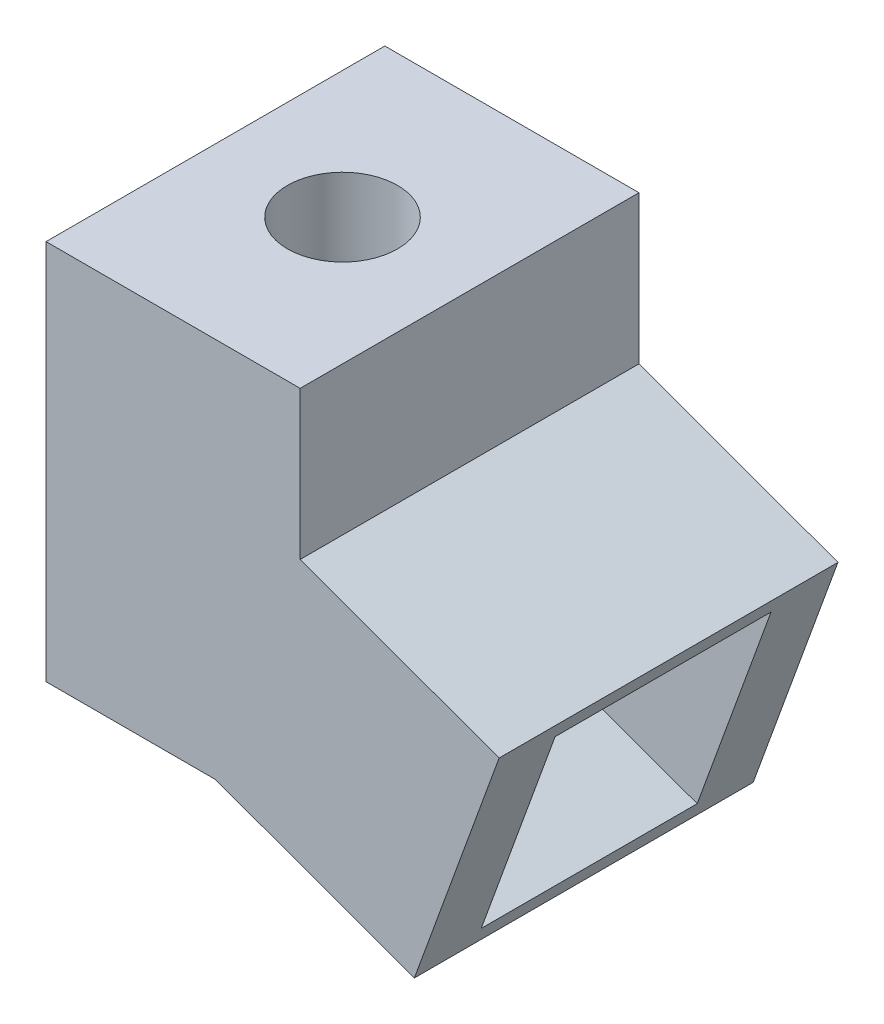
ISO-10303-21;
HEADER;
FILE_DESCRIPTION(('STEP AP214'),'2;1');
FILE_NAME('part.step','',(''),(''),'','','');
FILE_SCHEMA(('AUTOMOTIVE_DESIGN { 1 0 10303 214 1 1 1 1 }'));
ENDSEC;
DATA;
#1=APPLICATION_CONTEXT('core data for automotive mechanical design processes');
#2=APPLICATION_PROTOCOL_DEFINITION('international standard','automotive_design',2000,#1);
#3=PRODUCT_CONTEXT('',#1,'mechanical');
#4=PRODUCT('Part','Part','',(#3));
#5=PRODUCT_RELATED_PRODUCT_CATEGORY('part','',(#4));
#6=PRODUCT_DEFINITION_FORMATION('','',#4);
#7=PRODUCT_DEFINITION_CONTEXT('part definition',#1,'design');
#8=PRODUCT_DEFINITION('design','',#6,#7);
#9=PRODUCT_DEFINITION_SHAPE('','',#8);
#10=(LENGTH_UNIT() NAMED_UNIT(*) SI_UNIT(.MILLI.,.METRE.));
#11=(NAMED_UNIT(*) PLANE_ANGLE_UNIT() SI_UNIT($,.RADIAN.));
#12=(NAMED_UNIT(*) SI_UNIT($,.STERADIAN.) SOLID_ANGLE_UNIT());
#13=UNCERTAINTY_MEASURE_WITH_UNIT(LENGTH_MEASURE(1.E-05),#10,'distance_accuracy_value','');
#14=(GEOMETRIC_REPRESENTATION_CONTEXT(3) GLOBAL_UNCERTAINTY_ASSIGNED_CONTEXT((#13)) GLOBAL_UNIT_ASSIGNED_CONTEXT((#10,
#11,#12)) REPRESENTATION_CONTEXT('',''));
#15=CARTESIAN_POINT('',(0.,0.,0.));
#16=DIRECTION('',(0.,0.,1.));
#17=DIRECTION('',(1.,0.,0.));
#18=AXIS2_PLACEMENT_3D('',#15,#16,#17);
#19=CARTESIAN_POINT('',(10.5,-6.,-6.5));
#20=DIRECTION('',(0.,0.,1.));
#21=DIRECTION('',(1.,0.,0.));
#22=AXIS2_PLACEMENT_3D('',#19,#20,#21);
#23=PLANE('',#22);
#24=DIRECTION('',(0.,1.,0.));
#25=VECTOR('',#24,1.);
#26=CARTESIAN_POINT('',(10.5,-6.,-6.5));
#27=LINE('',#26,#25);
#28=CARTESIAN_POINT('',(10.5,-0.5,-6.5));
#29=VERTEX_POINT('',#28);
#30=CARTESIAN_POINT('',(10.5,3.,-6.5));
#31=VERTEX_POINT('',#30);
#32=EDGE_CURVE('E85',#29,#31,#27,.T.);
#33=ORIENTED_EDGE('',*,*,#32,.F.);
#34=DIRECTION('',(-0.93969262078591,0.342020143325663,0.));
#35=VECTOR('',#34,1.);
#36=CARTESIAN_POINT('',(15.1984631039296,-2.21010071662832,-6.5));
#37=LINE('',#36,#35);
#38=CARTESIAN_POINT('',(15.1984631039296,-2.21010071662832,-6.5));
#39=VERTEX_POINT('',#38);
#40=EDGE_CURVE('E244',#39,#29,#37,.T.);
#41=ORIENTED_EDGE('',*,*,#40,.F.);
#42=DIRECTION('',(0.342020143325663,0.939692620785911,0.));
#43=VECTOR('',#42,1.);
#44=CARTESIAN_POINT('',(15.1984631039296,-2.21010071662832,-6.5));
#45=LINE('',#44,#43);
#46=CARTESIAN_POINT('',(13.1966268154655,-7.71010071662832,-6.5));
#47=VERTEX_POINT('',#46);
#48=EDGE_CURVE('E234',#47,#39,#45,.T.);
#49=ORIENTED_EDGE('',*,*,#48,.F.);
#50=DIRECTION('',(-0.93969262078591,0.342020143325663,0.));
#51=VECTOR('',#50,1.);
#52=CARTESIAN_POINT('',(13.1966268154655,-7.71010071662832,-6.5));
#53=LINE('',#52,#51);
#54=CARTESIAN_POINT('',(8.49816371153593,-6.,-6.5));
#55=VERTEX_POINT('',#54);
#56=EDGE_CURVE('E247',#47,#55,#53,.T.);
#57=ORIENTED_EDGE('',*,*,#56,.T.);
#58=DIRECTION('',(1.,0.,0.));
#59=VECTOR('',#58,1.);
#60=CARTESIAN_POINT('',(10.5,-6.,-6.5));
#61=LINE('',#60,#59);
#62=CARTESIAN_POINT('',(4.5,-6.,-6.5));
#63=VERTEX_POINT('',#62);
#64=EDGE_CURVE('E284',#63,#55,#61,.T.);
#65=ORIENTED_EDGE('',*,*,#64,.F.);
#66=DIRECTION('',(0.,1.,0.));
#67=VECTOR('',#66,1.);
#68=CARTESIAN_POINT('',(4.5,-6.,-6.5));
#69=LINE('',#68,#67);
#70=CARTESIAN_POINT('',(4.5,3.,-6.5));
#71=VERTEX_POINT('',#70);
#72=EDGE_CURVE('E295',#63,#71,#69,.T.);
#73=ORIENTED_EDGE('',*,*,#72,.T.);
#74=DIRECTION('',(-1.,0.,0.));
#75=VECTOR('',#74,1.);
#76=CARTESIAN_POINT('',(4.5,3.,-6.5));
#77=LINE('',#76,#75);
#78=EDGE_CURVE('E207',#31,#71,#77,.T.);
#79=ORIENTED_EDGE('',*,*,#78,.F.);
#80=EDGE_LOOP('',(#33,#41,#49,#57,#65,#73,#79));
#81=FACE_BOUND('',#80,.T.);
#82=ADVANCED_FACE('F77',(#81),#23,.F.);
#83=CARTESIAN_POINT('',(10.5,-6.,1.5));
#84=DIRECTION('',(-1.,0.,0.));
#85=DIRECTION('',(0.,0.,1.));
#86=AXIS2_PLACEMENT_3D('',#83,#84,#85);
#87=PLANE('',#86);
#88=DIRECTION('',(0.,1.,0.));
#89=VECTOR('',#88,1.);
#90=CARTESIAN_POINT('',(10.5,-6.,1.5));
#91=LINE('',#90,#89);
#92=CARTESIAN_POINT('',(10.5,-0.500000000000003,1.5));
#93=VERTEX_POINT('',#92);
#94=CARTESIAN_POINT('',(10.5,3.,1.5));
#95=VERTEX_POINT('',#94);
#96=EDGE_CURVE('E301',#93,#95,#91,.T.);
#97=ORIENTED_EDGE('',*,*,#96,.F.);
#98=DIRECTION('',(0.,0.,-1.));
#99=VECTOR('',#98,1.);
#100=CARTESIAN_POINT('',(10.5,-0.5,7.3529777486175));
#101=LINE('',#100,#99);
#102=EDGE_CURVE('E272',#93,#29,#101,.T.);
#103=ORIENTED_EDGE('',*,*,#102,.T.);
#104=ORIENTED_EDGE('',*,*,#32,.T.);
#105=DIRECTION('',(0.,0.,-1.));
#106=VECTOR('',#105,1.);
#107=CARTESIAN_POINT('',(10.5,3.,-6.5));
#108=LINE('',#107,#106);
#109=EDGE_CURVE('E203',#95,#31,#108,.T.);
#110=ORIENTED_EDGE('',*,*,#109,.F.);
#111=EDGE_LOOP('',(#97,#103,#104,#110));
#112=FACE_BOUND('',#111,.T.);
#113=ADVANCED_FACE('F308',(#112),#87,.F.);
#114=CARTESIAN_POINT('',(10.5,-6.,1.5));
#115=DIRECTION('',(0.,0.,-1.));
#116=DIRECTION('',(-1.,0.,0.));
#117=AXIS2_PLACEMENT_3D('',#114,#115,#116);
#118=PLANE('',#117);
#119=DIRECTION('',(-1.,0.,0.));
#120=VECTOR('',#119,1.);
#121=CARTESIAN_POINT('',(10.5,-6.,1.5));
#122=LINE('',#121,#120);
#123=CARTESIAN_POINT('',(8.49816371153593,-6.,1.5));
#124=VERTEX_POINT('',#123);
#125=CARTESIAN_POINT('',(4.5,-6.,1.5));
#126=VERTEX_POINT('',#125);
#127=EDGE_CURVE('E290',#124,#126,#122,.T.);
#128=ORIENTED_EDGE('',*,*,#127,.F.);
#129=DIRECTION('',(-0.93969262078591,0.342020143325663,0.));
#130=VECTOR('',#129,1.);
#131=CARTESIAN_POINT('',(13.1966268154655,-7.71010071662832,1.5));
#132=LINE('',#131,#130);
#133=CARTESIAN_POINT('',(13.1966268154655,-7.71010071662832,1.5));
#134=VERTEX_POINT('',#133);
#135=EDGE_CURVE('E251',#134,#124,#132,.T.);
#136=ORIENTED_EDGE('',*,*,#135,.F.);
#137=DIRECTION('',(-0.342020143325663,-0.93969262078591,0.));
#138=VECTOR('',#137,1.);
#139=CARTESIAN_POINT('',(15.1984631039296,-2.21010071662832,1.5));
#140=LINE('',#139,#138);
#141=CARTESIAN_POINT('',(15.1984631039296,-2.21010071662832,1.5));
#142=VERTEX_POINT('',#141);
#143=EDGE_CURVE('E227',#142,#134,#140,.T.);
#144=ORIENTED_EDGE('',*,*,#143,.F.);
#145=DIRECTION('',(-0.93969262078591,0.342020143325663,0.));
#146=VECTOR('',#145,1.);
#147=CARTESIAN_POINT('',(15.1984631039296,-2.21010071662832,1.5));
#148=LINE('',#147,#146);
#149=EDGE_CURVE('E240',#142,#93,#148,.T.);
#150=ORIENTED_EDGE('',*,*,#149,.T.);
#151=ORIENTED_EDGE('',*,*,#96,.T.);
#152=DIRECTION('',(1.,0.,0.));
#153=VECTOR('',#152,1.);
#154=CARTESIAN_POINT('',(4.5,3.,1.5));
#155=LINE('',#154,#153);
#156=CARTESIAN_POINT('',(4.5,3.,1.5));
#157=VERTEX_POINT('',#156);
#158=EDGE_CURVE('E195',#157,#95,#155,.T.);
#159=ORIENTED_EDGE('',*,*,#158,.F.);
#160=DIRECTION('',(0.,1.,0.));
#161=VECTOR('',#160,1.);
#162=CARTESIAN_POINT('',(4.5,-6.,1.5));
#163=LINE('',#162,#161);
#164=EDGE_CURVE('E298',#126,#157,#163,.T.);
#165=ORIENTED_EDGE('',*,*,#164,.F.);
#166=EDGE_LOOP('',(#128,#136,#144,#150,#151,#159,#165));
#167=FACE_BOUND('',#166,.T.);
#168=ADVANCED_FACE('F322',(#167),#118,.F.);
#169=CARTESIAN_POINT('',(4.5,-6.,1.5));
#170=DIRECTION('',(1.,0.,0.));
#171=DIRECTION('',(0.,0.,-1.));
#172=AXIS2_PLACEMENT_3D('',#169,#170,#171);
#173=PLANE('',#172);
#174=DIRECTION('',(0.,0.,1.));
#175=VECTOR('',#174,1.);
#176=CARTESIAN_POINT('',(4.5,3.,-6.5));
#177=LINE('',#176,#175);
#178=EDGE_CURVE('E192',#71,#157,#177,.T.);
#179=ORIENTED_EDGE('',*,*,#178,.F.);
#180=ORIENTED_EDGE('',*,*,#72,.F.);
#181=DIRECTION('',(0.,0.,-1.));
#182=VECTOR('',#181,1.);
#183=CARTESIAN_POINT('',(4.5,-6.,1.5));
#184=LINE('',#183,#182);
#185=EDGE_CURVE('E100',#126,#63,#184,.T.);
#186=ORIENTED_EDGE('',*,*,#185,.F.);
#187=ORIENTED_EDGE('',*,*,#164,.T.);
#188=EDGE_LOOP('',(#179,#180,#186,#187));
#189=FACE_BOUND('',#188,.T.);
#190=ADVANCED_FACE('F318',(#189),#173,.F.);
#191=CARTESIAN_POINT('',(0.,-6.,0.));
#192=DIRECTION('',(0.,-1.,0.));
#193=DIRECTION('',(0.,0.,-1.));
#194=AXIS2_PLACEMENT_3D('',#191,#192,#193);
#195=PLANE('',#194);
#196=DIRECTION('',(0.,0.,-1.));
#197=VECTOR('',#196,1.);
#198=CARTESIAN_POINT('',(8.49816371153592,-6.,7.3529777486175));
#199=LINE('',#198,#197);
#200=EDGE_CURVE('E281',#124,#55,#199,.T.);
#201=ORIENTED_EDGE('',*,*,#200,.F.);
#202=ORIENTED_EDGE('',*,*,#127,.T.);
#203=ORIENTED_EDGE('',*,*,#185,.T.);
#204=ORIENTED_EDGE('',*,*,#64,.T.);
#205=EDGE_LOOP('',(#201,#202,#203,#204));
#206=FACE_BOUND('',#205,.T.);
#207=ADVANCED_FACE('F337',(#206),#195,.T.);
#208=CARTESIAN_POINT('',(14.1308933327259,-5.14322455670285,0.));
#209=DIRECTION('',(0.93969262078591,-0.342020143325663,0.));
#210=DIRECTION('',(0.342020143325663,0.93969262078591,0.));
#211=AXIS2_PLACEMENT_3D('',#208,#209,#210);
#212=PLANE('',#211);
#213=ORIENTED_EDGE('',*,*,#143,.T.);
#214=DIRECTION('',(0.,0.,-1.));
#215=VECTOR('',#214,1.);
#216=CARTESIAN_POINT('',(13.1966268154655,-7.71010071662832,1.5));
#217=LINE('',#216,#215);
#218=EDGE_CURVE('E231',#134,#47,#217,.T.);
#219=ORIENTED_EDGE('',*,*,#218,.T.);
#220=ORIENTED_EDGE('',*,*,#48,.T.);
#221=DIRECTION('',(0.,0.,1.));
#222=VECTOR('',#221,1.);
#223=CARTESIAN_POINT('',(15.1984631039296,-2.21010071662832,1.5));
#224=LINE('',#223,#222);
#225=EDGE_CURVE('E237',#39,#142,#224,.T.);
#226=ORIENTED_EDGE('',*,*,#225,.T.);
#227=EDGE_LOOP('',(#213,#219,#220,#226));
#228=FACE_BOUND('',#227,.T.);
#229=DIRECTION('',(0.,0.,-1.));
#230=VECTOR('',#229,1.);
#231=CARTESIAN_POINT('',(13.3253935942171,-7.35631689963239,0.0500000000000049));
#232=LINE('',#231,#230);
#233=CARTESIAN_POINT('',(13.3253935942171,-7.35631689963239,0.0500000000000049));
#234=VERTEX_POINT('',#233);
#235=CARTESIAN_POINT('',(13.3253935942171,-7.35631689963239,-5.05));
#236=VERTEX_POINT('',#235);
#237=EDGE_CURVE('E215',#234,#236,#232,.T.);
#238=ORIENTED_EDGE('',*,*,#237,.F.);
#239=DIRECTION('',(-0.342020143325663,-0.93969262078591,0.));
#240=VECTOR('',#239,1.);
#241=CARTESIAN_POINT('',(15.069696325178,-2.56388453362425,0.0500000000000053));
#242=LINE('',#241,#240);
#243=CARTESIAN_POINT('',(15.069696325178,-2.56388453362425,0.0500000000000053));
#244=VERTEX_POINT('',#243);
#245=EDGE_CURVE('E211',#244,#234,#242,.T.);
#246=ORIENTED_EDGE('',*,*,#245,.F.);
#247=DIRECTION('',(0.,0.,1.));
#248=VECTOR('',#247,1.);
#249=CARTESIAN_POINT('',(15.069696325178,-2.56388453362425,0.0500000000000053));
#250=LINE('',#249,#248);
#251=CARTESIAN_POINT('',(15.069696325178,-2.56388453362425,-5.04999999999999));
#252=VERTEX_POINT('',#251);
#253=EDGE_CURVE('E223',#252,#244,#250,.T.);
#254=ORIENTED_EDGE('',*,*,#253,.F.);
#255=DIRECTION('',(0.342020143325663,0.939692620785911,0.));
#256=VECTOR('',#255,1.);
#257=CARTESIAN_POINT('',(15.069696325178,-2.56388453362425,-5.04999999999999));
#258=LINE('',#257,#256);
#259=EDGE_CURVE('E219',#236,#252,#258,.T.);
#260=ORIENTED_EDGE('',*,*,#259,.F.);
#261=EDGE_LOOP('',(#238,#246,#254,#260));
#262=FACE_BOUND('',#261,.T.);
#263=ADVANCED_FACE('F332',(#228,#262),#212,.T.);
#264=CARTESIAN_POINT('',(13.1966268154655,-7.71010071662832,1.5));
#265=DIRECTION('',(0.342020143325663,0.93969262078591,0.));
#266=DIRECTION('',(-0.93969262078591,0.342020143325663,0.));
#267=AXIS2_PLACEMENT_3D('',#264,#265,#266);
#268=PLANE('',#267);
#269=ORIENTED_EDGE('',*,*,#200,.T.);
#270=ORIENTED_EDGE('',*,*,#56,.F.);
#271=ORIENTED_EDGE('',*,*,#218,.F.);
#272=ORIENTED_EDGE('',*,*,#135,.T.);
#273=EDGE_LOOP('',(#269,#270,#271,#272));
#274=FACE_BOUND('',#273,.T.);
#275=ADVANCED_FACE('F335',(#274),#268,.F.);
#276=CARTESIAN_POINT('',(15.1984631039296,-2.21010071662832,1.5));
#277=DIRECTION('',(-0.342020143325663,-0.93969262078591,0.));
#278=DIRECTION('',(0.93969262078591,-0.342020143325663,0.));
#279=AXIS2_PLACEMENT_3D('',#276,#277,#278);
#280=PLANE('',#279);
#281=ORIENTED_EDGE('',*,*,#102,.F.);
#282=ORIENTED_EDGE('',*,*,#149,.F.);
#283=ORIENTED_EDGE('',*,*,#225,.F.);
#284=ORIENTED_EDGE('',*,*,#40,.T.);
#285=EDGE_LOOP('',(#281,#282,#283,#284));
#286=FACE_BOUND('',#285,.T.);
#287=ADVANCED_FACE('F328',(#286),#280,.F.);
#288=CARTESIAN_POINT('',(7.55304498722449,-2.74908355342321,0.));
#289=DIRECTION('',(-0.93969262078591,0.342020143325663,0.));
#290=DIRECTION('',(-0.342020143325663,-0.93969262078591,0.));
#291=AXIS2_PLACEMENT_3D('',#288,#289,#290);
#292=PLANE('',#291);
#293=DIRECTION('',(0.,0.,1.));
#294=VECTOR('',#293,1.);
#295=CARTESIAN_POINT('',(8.49184797967659,-0.1697435303446,-5.04999999999999));
#296=LINE('',#295,#294);
#297=CARTESIAN_POINT('',(8.49184797967659,-0.1697435303446,-5.04999999999999));
#298=VERTEX_POINT('',#297);
#299=CARTESIAN_POINT('',(8.49184797967659,-0.169743530344602,-3.34037942931242));
#300=VERTEX_POINT('',#299);
#301=EDGE_CURVE('E190',#298,#300,#296,.T.);
#302=ORIENTED_EDGE('',*,*,#301,.T.);
#303=CARTESIAN_POINT('',(7.5,-2.89482345803777,-2.5));
#304=DIRECTION('',(-0.93969262078591,0.342020143325663,0.));
#305=DIRECTION('',(0.342020143325663,0.93969262078591,0.));
#306=AXIS2_PLACEMENT_3D('',#303,#304,#305);
#307=ELLIPSE('',#306,3.80094572021207,1.3);
#308=CARTESIAN_POINT('',(7.82568910364889,-2.,-3.75854146048685));
#309=VERTEX_POINT('',#308);
#310=EDGE_CURVE('E92',#300,#309,#307,.T.);
#311=ORIENTED_EDGE('',*,*,#310,.T.);
#312=DIRECTION('',(0.,0.,-1.));
#313=VECTOR('',#312,1.);
#314=CARTESIAN_POINT('',(7.82568910364889,-2.,0.));
#315=LINE('',#314,#313);
#316=CARTESIAN_POINT('',(7.82568910364889,-2.,-1.24145853951315));
#317=VERTEX_POINT('',#316);
#318=EDGE_CURVE('E12',#317,#309,#315,.T.);
#319=ORIENTED_EDGE('',*,*,#318,.F.);
#320=CARTESIAN_POINT('',(8.49184797967659,-0.169743530344603,-1.65962057068758));
#321=VERTEX_POINT('',#320);
#322=EDGE_CURVE('E171',#317,#321,#307,.T.);
#323=ORIENTED_EDGE('',*,*,#322,.T.);
#324=CARTESIAN_POINT('',(8.49184797967659,-0.169743530344604,0.0500000000000043));
#325=VERTEX_POINT('',#324);
#326=EDGE_CURVE('E265',#321,#325,#296,.T.);
#327=ORIENTED_EDGE('',*,*,#326,.T.);
#328=DIRECTION('',(-0.342020143325663,-0.93969262078591,0.));
#329=VECTOR('',#328,1.);
#330=CARTESIAN_POINT('',(8.49184797967659,-0.169743530344604,0.0500000000000043));
#331=LINE('',#330,#329);
#332=CARTESIAN_POINT('',(6.7475452487157,-4.96217589635275,0.05));
#333=VERTEX_POINT('',#332);
#334=EDGE_CURVE('E254',#325,#333,#331,.T.);
#335=ORIENTED_EDGE('',*,*,#334,.T.);
#336=DIRECTION('',(0.,0.,-1.));
#337=VECTOR('',#336,1.);
#338=CARTESIAN_POINT('',(6.74754524871571,-4.96217589635274,-5.05));
#339=LINE('',#338,#337);
#340=CARTESIAN_POINT('',(6.74754524871571,-4.96217589635274,-5.05));
#341=VERTEX_POINT('',#340);
#342=EDGE_CURVE('E258',#333,#341,#339,.T.);
#343=ORIENTED_EDGE('',*,*,#342,.T.);
#344=DIRECTION('',(0.342020143325663,0.93969262078591,0.));
#345=VECTOR('',#344,1.);
#346=CARTESIAN_POINT('',(8.49184797967659,-0.1697435303446,-5.04999999999999));
#347=LINE('',#346,#345);
#348=EDGE_CURVE('E262',#341,#298,#347,.T.);
#349=ORIENTED_EDGE('',*,*,#348,.T.);
#350=EDGE_LOOP('',(#302,#311,#319,#323,#327,#335,#343,#349));
#351=FACE_BOUND('',#350,.T.);
#352=ADVANCED_FACE('F187',(#351),#292,.F.);
#353=CARTESIAN_POINT('',(8.49184797967659,-0.1697435303446,-5.04999999999999));
#354=DIRECTION('',(0.,0.,-1.));
#355=DIRECTION('',(0.,1.,0.));
#356=AXIS2_PLACEMENT_3D('',#353,#354,#355);
#357=PLANE('',#356);
#358=DIRECTION('',(0.93969262078591,-0.342020143325663,0.));
#359=VECTOR('',#358,1.);
#360=CARTESIAN_POINT('',(6.74754524871571,-4.96217589635274,-5.05));
#361=LINE('',#360,#359);
#362=EDGE_CURVE('E276',#341,#236,#361,.T.);
#363=ORIENTED_EDGE('',*,*,#362,.T.);
#364=ORIENTED_EDGE('',*,*,#259,.T.);
#365=DIRECTION('',(0.93969262078591,-0.342020143325663,0.));
#366=VECTOR('',#365,1.);
#367=CARTESIAN_POINT('',(8.49184797967659,-0.1697435303446,-5.04999999999999));
#368=LINE('',#367,#366);
#369=EDGE_CURVE('E273',#298,#252,#368,.T.);
#370=ORIENTED_EDGE('',*,*,#369,.F.);
#371=ORIENTED_EDGE('',*,*,#348,.F.);
#372=EDGE_LOOP('',(#363,#364,#370,#371));
#373=FACE_BOUND('',#372,.T.);
#374=ADVANCED_FACE('F368',(#373),#357,.F.);
#375=CARTESIAN_POINT('',(8.49184797967659,-0.1697435303446,-5.04999999999999));
#376=DIRECTION('',(0.342020143325663,0.93969262078591,0.));
#377=DIRECTION('',(-0.93969262078591,0.342020143325663,0.));
#378=AXIS2_PLACEMENT_3D('',#375,#376,#377);
#379=PLANE('',#378);
#380=ORIENTED_EDGE('',*,*,#326,.F.);
#381=CARTESIAN_POINT('',(7.5,0.191259611174739,-2.5));
#382=DIRECTION('',(0.342020143325663,0.93969262078591,0.));
#383=DIRECTION('',(-0.939692620785911,0.342020143325663,0.));
#384=AXIS2_PLACEMENT_3D('',#381,#382,#383);
#385=ELLIPSE('',#384,1.38343110421868,1.3);
#386=EDGE_CURVE('E175',#321,#300,#385,.T.);
#387=ORIENTED_EDGE('',*,*,#386,.T.);
#388=ORIENTED_EDGE('',*,*,#301,.F.);
#389=ORIENTED_EDGE('',*,*,#369,.T.);
#390=ORIENTED_EDGE('',*,*,#253,.T.);
#391=DIRECTION('',(0.93969262078591,-0.342020143325663,0.));
#392=VECTOR('',#391,1.);
#393=CARTESIAN_POINT('',(8.49184797967659,-0.169743530344604,0.0500000000000043));
#394=LINE('',#393,#392);
#395=EDGE_CURVE('E269',#325,#244,#394,.T.);
#396=ORIENTED_EDGE('',*,*,#395,.F.);
#397=EDGE_LOOP('',(#380,#387,#388,#389,#390,#396));
#398=FACE_BOUND('',#397,.T.);
#399=ADVANCED_FACE('F375',(#398),#379,.F.);
#400=CARTESIAN_POINT('',(8.49184797967659,-0.169743530344604,0.0500000000000043));
#401=DIRECTION('',(0.,0.,1.));
#402=DIRECTION('',(0.,-1.,0.));
#403=AXIS2_PLACEMENT_3D('',#400,#401,#402);
#404=PLANE('',#403);
#405=ORIENTED_EDGE('',*,*,#395,.T.);
#406=ORIENTED_EDGE('',*,*,#245,.T.);
#407=DIRECTION('',(0.93969262078591,-0.342020143325663,0.));
#408=VECTOR('',#407,1.);
#409=CARTESIAN_POINT('',(6.7475452487157,-4.96217589635275,0.05));
#410=LINE('',#409,#408);
#411=EDGE_CURVE('E268',#333,#234,#410,.T.);
#412=ORIENTED_EDGE('',*,*,#411,.F.);
#413=ORIENTED_EDGE('',*,*,#334,.F.);
#414=EDGE_LOOP('',(#405,#406,#412,#413));
#415=FACE_BOUND('',#414,.T.);
#416=ADVANCED_FACE('F379',(#415),#404,.F.);
#417=CARTESIAN_POINT('',(6.74754524871571,-4.96217589635274,-5.05));
#418=DIRECTION('',(-0.342020143325663,-0.93969262078591,0.));
#419=DIRECTION('',(0.93969262078591,-0.342020143325663,0.));
#420=AXIS2_PLACEMENT_3D('',#417,#418,#419);
#421=PLANE('',#420);
#422=ORIENTED_EDGE('',*,*,#411,.T.);
#423=ORIENTED_EDGE('',*,*,#237,.T.);
#424=ORIENTED_EDGE('',*,*,#362,.F.);
#425=ORIENTED_EDGE('',*,*,#342,.F.);
#426=EDGE_LOOP('',(#422,#423,#424,#425));
#427=FACE_BOUND('',#426,.T.);
#428=ADVANCED_FACE('F390',(#427),#421,.F.);
#429=CARTESIAN_POINT('',(0.,3.,0.));
#430=DIRECTION('',(0.,1.,0.));
#431=DIRECTION('',(0.,0.,1.));
#432=AXIS2_PLACEMENT_3D('',#429,#430,#431);
#433=PLANE('',#432);
#434=CARTESIAN_POINT('',(7.5,3.,-2.5));
#435=DIRECTION('',(0.,1.,0.));
#436=DIRECTION('',(0.,0.,1.));
#437=AXIS2_PLACEMENT_3D('',#434,#435,#436);
#438=CIRCLE('',#437,1.3);
#439=CARTESIAN_POINT('',(7.5,3.,-1.2));
#440=VERTEX_POINT('',#439);
#441=EDGE_CURVE('E184',#440,#440,#438,.T.);
#442=ORIENTED_EDGE('',*,*,#441,.F.);
#443=EDGE_LOOP('',(#442));
#444=FACE_BOUND('',#443,.T.);
#445=ORIENTED_EDGE('',*,*,#178,.T.);
#446=ORIENTED_EDGE('',*,*,#158,.T.);
#447=ORIENTED_EDGE('',*,*,#109,.T.);
#448=ORIENTED_EDGE('',*,*,#78,.T.);
#449=EDGE_LOOP('',(#445,#446,#447,#448));
#450=FACE_BOUND('',#449,.T.);
#451=ADVANCED_FACE('F313',(#444,#450),#433,.T.);
#452=CARTESIAN_POINT('',(0.,-2.,0.));
#453=DIRECTION('',(0.,1.,0.));
#454=DIRECTION('',(0.,0.,1.));
#455=AXIS2_PLACEMENT_3D('',#452,#453,#454);
#456=PLANE('',#455);
#457=ORIENTED_EDGE('',*,*,#318,.T.);
#458=CARTESIAN_POINT('',(7.5,-2.,-2.5));
#459=DIRECTION('',(0.,1.,0.));
#460=DIRECTION('',(0.,0.,1.));
#461=AXIS2_PLACEMENT_3D('',#458,#459,#460);
#462=CIRCLE('',#461,1.3);
#463=EDGE_CURVE('E174',#309,#317,#462,.T.);
#464=ORIENTED_EDGE('',*,*,#463,.T.);
#465=EDGE_LOOP('',(#457,#464));
#466=FACE_BOUND('',#465,.T.);
#467=ADVANCED_FACE('F182',(#466),#456,.T.);
#468=CARTESIAN_POINT('',(7.5,-2.,-2.5));
#469=DIRECTION('',(0.,1.,0.));
#470=DIRECTION('',(0.,0.,1.));
#471=AXIS2_PLACEMENT_3D('',#468,#469,#470);
#472=CYLINDRICAL_SURFACE('',#471,1.3);
#473=ORIENTED_EDGE('',*,*,#441,.T.);
#474=EDGE_LOOP('',(#473));
#475=FACE_BOUND('',#474,.T.);
#476=ORIENTED_EDGE('',*,*,#386,.F.);
#477=ORIENTED_EDGE('',*,*,#322,.F.);
#478=ORIENTED_EDGE('',*,*,#463,.F.);
#479=ORIENTED_EDGE('',*,*,#310,.F.);
#480=EDGE_LOOP('',(#476,#477,#478,#479));
#481=FACE_BOUND('',#480,.T.);
#482=ADVANCED_FACE('F173',(#475,#481),#472,.F.);
#483=CLOSED_SHELL('',(#82,#113,#168,#190,#207,#263,#275,#287,#352,#374,#399,#416,#428,#451,#467,#482));
#484=MANIFOLD_SOLID_BREP('B2',#483);
#485=ADVANCED_BREP_SHAPE_REPRESENTATION('',(#18,#484),#14);
#486=SHAPE_DEFINITION_REPRESENTATION(#9,#485);
ENDSEC;
END-ISO-10303-21;
